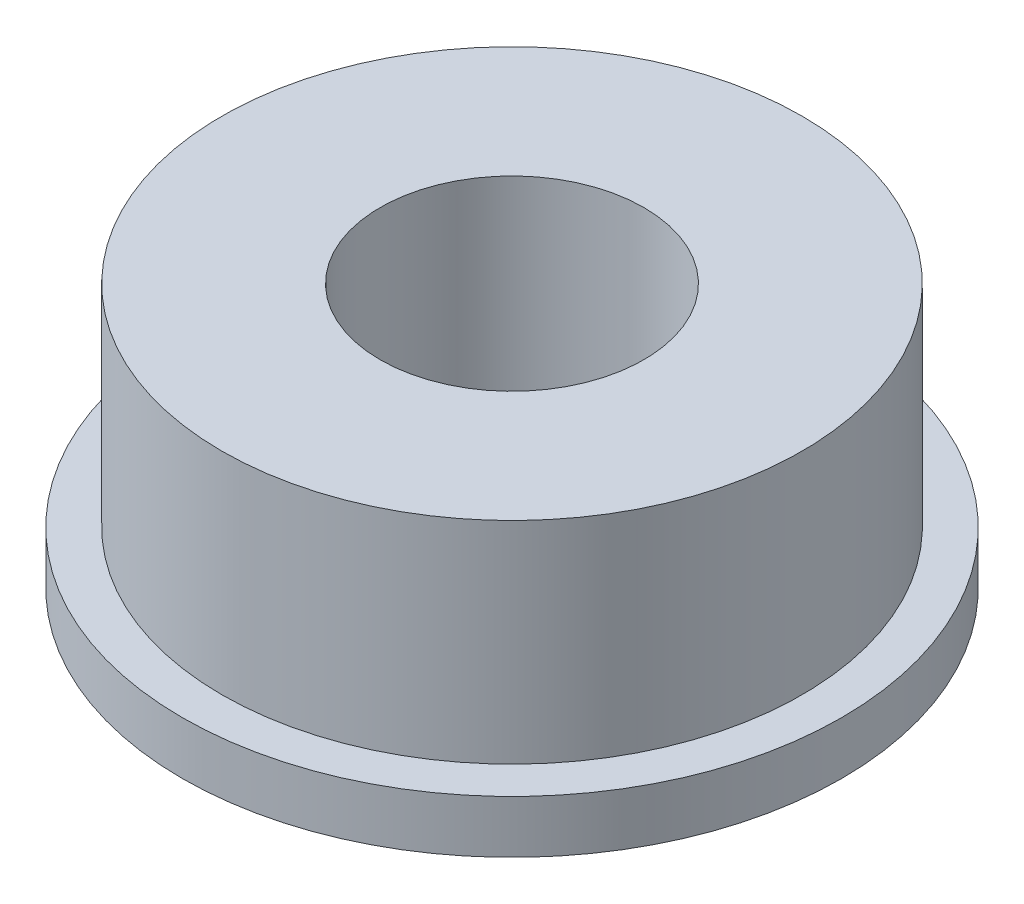
ISO-10303-21;
HEADER;
FILE_DESCRIPTION(('STEP AP214'),'2;1');
FILE_NAME('part.step','',(''),(''),'','','');
FILE_SCHEMA(('AUTOMOTIVE_DESIGN { 1 0 10303 214 1 1 1 1 }'));
ENDSEC;
DATA;
#1=APPLICATION_CONTEXT('core data for automotive mechanical design processes');
#2=APPLICATION_PROTOCOL_DEFINITION('international standard','automotive_design',2000,#1);
#3=PRODUCT_CONTEXT('',#1,'mechanical');
#4=PRODUCT('Part','Part','',(#3));
#5=PRODUCT_RELATED_PRODUCT_CATEGORY('part','',(#4));
#6=PRODUCT_DEFINITION_FORMATION('','',#4);
#7=PRODUCT_DEFINITION_CONTEXT('part definition',#1,'design');
#8=PRODUCT_DEFINITION('design','',#6,#7);
#9=PRODUCT_DEFINITION_SHAPE('','',#8);
#10=(LENGTH_UNIT() NAMED_UNIT(*) SI_UNIT(.MILLI.,.METRE.));
#11=(NAMED_UNIT(*) PLANE_ANGLE_UNIT() SI_UNIT($,.RADIAN.));
#12=(NAMED_UNIT(*) SI_UNIT($,.STERADIAN.) SOLID_ANGLE_UNIT());
#13=UNCERTAINTY_MEASURE_WITH_UNIT(LENGTH_MEASURE(1.E-05),#10,'distance_accuracy_value','');
#14=(GEOMETRIC_REPRESENTATION_CONTEXT(3) GLOBAL_UNCERTAINTY_ASSIGNED_CONTEXT((#13)) GLOBAL_UNIT_ASSIGNED_CONTEXT((#10,
#11,#12)) REPRESENTATION_CONTEXT('',''));
#15=CARTESIAN_POINT('',(0.,0.,0.));
#16=DIRECTION('',(0.,0.,1.));
#17=DIRECTION('',(1.,0.,0.));
#18=AXIS2_PLACEMENT_3D('',#15,#16,#17);
#19=CARTESIAN_POINT('',(0.,4.,0.));
#20=DIRECTION('',(0.,1.,0.));
#21=DIRECTION('',(0.,0.,1.));
#22=AXIS2_PLACEMENT_3D('',#19,#20,#21);
#23=PLANE('',#22);
#24=CARTESIAN_POINT('',(0.,4.,0.));
#25=DIRECTION('',(0.,1.,0.));
#26=DIRECTION('',(0.,0.,1.));
#27=AXIS2_PLACEMENT_3D('',#24,#25,#26);
#28=CIRCLE('',#27,5.5);
#29=CARTESIAN_POINT('',(0.,4.,5.5));
#30=VERTEX_POINT('',#29);
#31=EDGE_CURVE('E10',#30,#30,#28,.T.);
#32=ORIENTED_EDGE('',*,*,#31,.T.);
#33=EDGE_LOOP('',(#32));
#34=FACE_BOUND('',#33,.T.);
#35=CARTESIAN_POINT('',(0.,4.,0.));
#36=DIRECTION('',(0.,1.,0.));
#37=DIRECTION('',(0.,0.,1.));
#38=AXIS2_PLACEMENT_3D('',#35,#36,#37);
#39=CIRCLE('',#38,2.5);
#40=CARTESIAN_POINT('',(0.,4.,2.5));
#41=VERTEX_POINT('',#40);
#42=EDGE_CURVE('E40',#41,#41,#39,.T.);
#43=ORIENTED_EDGE('',*,*,#42,.F.);
#44=EDGE_LOOP('',(#43));
#45=FACE_BOUND('',#44,.T.);
#46=ADVANCED_FACE('F32',(#34,#45),#23,.T.);
#47=CARTESIAN_POINT('',(0.,4.,0.));
#48=DIRECTION('',(0.,-1.,0.));
#49=DIRECTION('',(0.,0.,-1.));
#50=AXIS2_PLACEMENT_3D('',#47,#48,#49);
#51=CYLINDRICAL_SURFACE('',#50,5.5);
#52=ORIENTED_EDGE('',*,*,#31,.F.);
#53=EDGE_LOOP('',(#52));
#54=FACE_BOUND('',#53,.T.);
#55=CARTESIAN_POINT('',(0.,0.,0.));
#56=DIRECTION('',(0.,1.,0.));
#57=DIRECTION('',(0.,0.,1.));
#58=AXIS2_PLACEMENT_3D('',#55,#56,#57);
#59=CIRCLE('',#58,5.5);
#60=CARTESIAN_POINT('',(0.,0.,5.5));
#61=VERTEX_POINT('',#60);
#62=EDGE_CURVE('E36',#61,#61,#59,.T.);
#63=ORIENTED_EDGE('',*,*,#62,.T.);
#64=EDGE_LOOP('',(#63));
#65=FACE_BOUND('',#64,.T.);
#66=ADVANCED_FACE('F34',(#54,#65),#51,.T.);
#67=CARTESIAN_POINT('',(0.,4.,0.));
#68=DIRECTION('',(0.,-1.,0.));
#69=DIRECTION('',(0.,0.,-1.));
#70=AXIS2_PLACEMENT_3D('',#67,#68,#69);
#71=CYLINDRICAL_SURFACE('',#70,2.5);
#72=ORIENTED_EDGE('',*,*,#42,.T.);
#73=EDGE_LOOP('',(#72));
#74=FACE_BOUND('',#73,.T.);
#75=CARTESIAN_POINT('',(0.,-1.,0.));
#76=DIRECTION('',(0.,-1.,0.));
#77=DIRECTION('',(0.,0.,-1.));
#78=AXIS2_PLACEMENT_3D('',#75,#76,#77);
#79=CIRCLE('',#78,2.5);
#80=CARTESIAN_POINT('',(0.,-1.,-2.5));
#81=VERTEX_POINT('',#80);
#82=EDGE_CURVE('E50',#81,#81,#79,.T.);
#83=ORIENTED_EDGE('',*,*,#82,.T.);
#84=EDGE_LOOP('',(#83));
#85=FACE_BOUND('',#84,.T.);
#86=ADVANCED_FACE('F56',(#74,#85),#71,.F.);
#87=CARTESIAN_POINT('',(0.,-1.,0.));
#88=DIRECTION('',(0.,-1.,0.));
#89=DIRECTION('',(0.,0.,-1.));
#90=AXIS2_PLACEMENT_3D('',#87,#88,#89);
#91=PLANE('',#90);
#92=CARTESIAN_POINT('',(0.,-1.,0.));
#93=DIRECTION('',(0.,-1.,0.));
#94=DIRECTION('',(0.,0.,-1.));
#95=AXIS2_PLACEMENT_3D('',#92,#93,#94);
#96=CIRCLE('',#95,6.25);
#97=CARTESIAN_POINT('',(0.,-1.,-6.25));
#98=VERTEX_POINT('',#97);
#99=EDGE_CURVE('E49',#98,#98,#96,.T.);
#100=ORIENTED_EDGE('',*,*,#99,.T.);
#101=EDGE_LOOP('',(#100));
#102=FACE_BOUND('',#101,.T.);
#103=ORIENTED_EDGE('',*,*,#82,.F.);
#104=EDGE_LOOP('',(#103));
#105=FACE_BOUND('',#104,.T.);
#106=ADVANCED_FACE('F58',(#102,#105),#91,.T.);
#107=CARTESIAN_POINT('',(0.,0.,0.));
#108=DIRECTION('',(0.,-1.,0.));
#109=DIRECTION('',(0.,0.,-1.));
#110=AXIS2_PLACEMENT_3D('',#107,#108,#109);
#111=PLANE('',#110);
#112=ORIENTED_EDGE('',*,*,#62,.F.);
#113=EDGE_LOOP('',(#112));
#114=FACE_BOUND('',#113,.T.);
#115=CARTESIAN_POINT('',(0.,0.,0.));
#116=DIRECTION('',(0.,-1.,0.));
#117=DIRECTION('',(0.,0.,-1.));
#118=AXIS2_PLACEMENT_3D('',#115,#116,#117);
#119=CIRCLE('',#118,6.25);
#120=CARTESIAN_POINT('',(0.,0.,-6.25));
#121=VERTEX_POINT('',#120);
#122=EDGE_CURVE('E46',#121,#121,#119,.T.);
#123=ORIENTED_EDGE('',*,*,#122,.F.);
#124=EDGE_LOOP('',(#123));
#125=FACE_BOUND('',#124,.T.);
#126=ADVANCED_FACE('F60',(#114,#125),#111,.F.);
#127=CARTESIAN_POINT('',(0.,-1.,0.));
#128=DIRECTION('',(0.,1.,0.));
#129=DIRECTION('',(0.,0.,1.));
#130=AXIS2_PLACEMENT_3D('',#127,#128,#129);
#131=CYLINDRICAL_SURFACE('',#130,6.25);
#132=ORIENTED_EDGE('',*,*,#99,.F.);
#133=EDGE_LOOP('',(#132));
#134=FACE_BOUND('',#133,.T.);
#135=ORIENTED_EDGE('',*,*,#122,.T.);
#136=EDGE_LOOP('',(#135));
#137=FACE_BOUND('',#136,.T.);
#138=ADVANCED_FACE('F67',(#134,#137),#131,.T.);
#139=CLOSED_SHELL('',(#46,#66,#86,#106,#126,#138));
#140=MANIFOLD_SOLID_BREP('B2',#139);
#141=ADVANCED_BREP_SHAPE_REPRESENTATION('',(#18,#140),#14);
#142=SHAPE_DEFINITION_REPRESENTATION(#9,#141);
ENDSEC;
END-ISO-10303-21;
